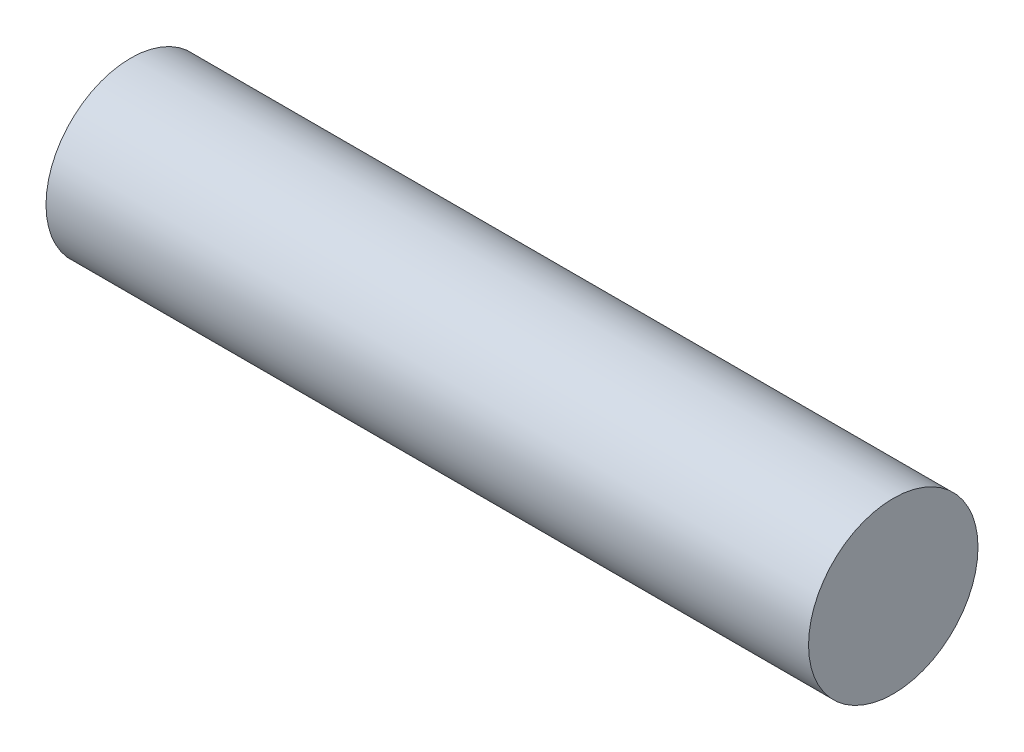
ISO-10303-21;
HEADER;
FILE_DESCRIPTION(('STEP AP214'),'2;1');
FILE_NAME('part.step','',(''),(''),'','','');
FILE_SCHEMA(('AUTOMOTIVE_DESIGN { 1 0 10303 214 1 1 1 1 }'));
ENDSEC;
DATA;
#1=APPLICATION_CONTEXT('core data for automotive mechanical design processes');
#2=APPLICATION_PROTOCOL_DEFINITION('international standard','automotive_design',2000,#1);
#3=PRODUCT_CONTEXT('',#1,'mechanical');
#4=PRODUCT('Part','Part','',(#3));
#5=PRODUCT_RELATED_PRODUCT_CATEGORY('part','',(#4));
#6=PRODUCT_DEFINITION_FORMATION('','',#4);
#7=PRODUCT_DEFINITION_CONTEXT('part definition',#1,'design');
#8=PRODUCT_DEFINITION('design','',#6,#7);
#9=PRODUCT_DEFINITION_SHAPE('','',#8);
#10=(LENGTH_UNIT() NAMED_UNIT(*) SI_UNIT(.MILLI.,.METRE.));
#11=(NAMED_UNIT(*) PLANE_ANGLE_UNIT() SI_UNIT($,.RADIAN.));
#12=(NAMED_UNIT(*) SI_UNIT($,.STERADIAN.) SOLID_ANGLE_UNIT());
#13=UNCERTAINTY_MEASURE_WITH_UNIT(LENGTH_MEASURE(1.E-05),#10,'distance_accuracy_value','');
#14=(GEOMETRIC_REPRESENTATION_CONTEXT(3) GLOBAL_UNCERTAINTY_ASSIGNED_CONTEXT((#13)) GLOBAL_UNIT_ASSIGNED_CONTEXT((#10,
#11,#12)) REPRESENTATION_CONTEXT('',''));
#15=CARTESIAN_POINT('',(0.,0.,0.));
#16=DIRECTION('',(0.,0.,1.));
#17=DIRECTION('',(1.,0.,0.));
#18=AXIS2_PLACEMENT_3D('',#15,#16,#17);
#19=CARTESIAN_POINT('',(22.5,0.,0.));
#20=DIRECTION('',(-1.,0.,0.));
#21=DIRECTION('',(0.,0.,1.));
#22=AXIS2_PLACEMENT_3D('',#19,#20,#21);
#23=CYLINDRICAL_SURFACE('',#22,2.5);
#24=CARTESIAN_POINT('',(22.5,0.,0.));
#25=DIRECTION('',(1.,0.,0.));
#26=DIRECTION('',(0.,0.,-1.));
#27=AXIS2_PLACEMENT_3D('',#24,#25,#26);
#28=CIRCLE('',#27,2.5);
#29=CARTESIAN_POINT('',(22.5,0.,2.5));
#30=VERTEX_POINT('',#29);
#31=EDGE_CURVE('E10',#30,#30,#28,.T.);
#32=CARTESIAN_POINT('',(0.,0.,0.));
#33=DIRECTION('',(1.,0.,0.));
#34=DIRECTION('',(0.,0.,-1.));
#35=AXIS2_PLACEMENT_3D('',#32,#33,#34);
#36=CIRCLE('',#35,2.5);
#37=CARTESIAN_POINT('',(0.,0.,2.5));
#38=VERTEX_POINT('',#37);
#39=EDGE_CURVE('E46',#38,#38,#36,.T.);
#40=CARTESIAN_POINT('',(22.5,0.,2.5));
#41=CARTESIAN_POINT('',(22.265625,0.,2.5));
#42=CARTESIAN_POINT('',(22.03125,0.,2.5));
#43=CARTESIAN_POINT('',(21.5625,0.,2.5));
#44=CARTESIAN_POINT('',(21.328125,0.,2.5));
#45=CARTESIAN_POINT('',(20.859375,0.,2.5));
#46=CARTESIAN_POINT('',(20.625,0.,2.5));
#47=CARTESIAN_POINT('',(20.15625,0.,2.5));
#48=CARTESIAN_POINT('',(19.921875,0.,2.5));
#49=CARTESIAN_POINT('',(19.453125,0.,2.5));
#50=CARTESIAN_POINT('',(19.21875,0.,2.5));
#51=CARTESIAN_POINT('',(18.75,0.,2.5));
#52=CARTESIAN_POINT('',(18.515625,0.,2.5));
#53=CARTESIAN_POINT('',(18.046875,0.,2.5));
#54=CARTESIAN_POINT('',(17.8125,0.,2.5));
#55=CARTESIAN_POINT('',(17.34375,0.,2.5));
#56=CARTESIAN_POINT('',(17.109375,0.,2.5));
#57=CARTESIAN_POINT('',(16.640625,0.,2.5));
#58=CARTESIAN_POINT('',(16.40625,0.,2.5));
#59=CARTESIAN_POINT('',(15.9375,0.,2.5));
#60=CARTESIAN_POINT('',(15.703125,0.,2.5));
#61=CARTESIAN_POINT('',(15.234375,0.,2.5));
#62=CARTESIAN_POINT('',(15.,0.,2.5));
#63=CARTESIAN_POINT('',(14.53125,0.,2.5));
#64=CARTESIAN_POINT('',(14.296875,0.,2.5));
#65=CARTESIAN_POINT('',(13.828125,0.,2.5));
#66=CARTESIAN_POINT('',(13.59375,0.,2.5));
#67=CARTESIAN_POINT('',(13.125,0.,2.5));
#68=CARTESIAN_POINT('',(12.890625,0.,2.5));
#69=CARTESIAN_POINT('',(12.421875,0.,2.5));
#70=CARTESIAN_POINT('',(12.1875,0.,2.5));
#71=CARTESIAN_POINT('',(11.71875,0.,2.5));
#72=CARTESIAN_POINT('',(11.484375,0.,2.5));
#73=CARTESIAN_POINT('',(11.015625,0.,2.5));
#74=CARTESIAN_POINT('',(10.78125,0.,2.5));
#75=CARTESIAN_POINT('',(10.3125,0.,2.5));
#76=CARTESIAN_POINT('',(10.078125,0.,2.5));
#77=CARTESIAN_POINT('',(9.60937499999999,0.,2.5));
#78=CARTESIAN_POINT('',(9.375,0.,2.5));
#79=CARTESIAN_POINT('',(8.90625,0.,2.5));
#80=CARTESIAN_POINT('',(8.671875,0.,2.5));
#81=CARTESIAN_POINT('',(8.20312499999999,0.,2.5));
#82=CARTESIAN_POINT('',(7.96874999999999,0.,2.5));
#83=CARTESIAN_POINT('',(7.5,0.,2.5));
#84=CARTESIAN_POINT('',(7.265625,0.,2.5));
#85=CARTESIAN_POINT('',(6.796875,0.,2.5));
#86=CARTESIAN_POINT('',(6.5625,0.,2.5));
#87=CARTESIAN_POINT('',(6.09375,0.,2.5));
#88=CARTESIAN_POINT('',(5.859375,0.,2.5));
#89=CARTESIAN_POINT('',(5.390625,0.,2.5));
#90=CARTESIAN_POINT('',(5.15625,0.,2.5));
#91=CARTESIAN_POINT('',(4.6875,0.,2.5));
#92=CARTESIAN_POINT('',(4.453125,0.,2.5));
#93=CARTESIAN_POINT('',(3.984375,0.,2.5));
#94=CARTESIAN_POINT('',(3.75,0.,2.5));
#95=CARTESIAN_POINT('',(3.28125,0.,2.5));
#96=CARTESIAN_POINT('',(3.046875,0.,2.5));
#97=CARTESIAN_POINT('',(2.578125,0.,2.5));
#98=CARTESIAN_POINT('',(2.34375,0.,2.5));
#99=CARTESIAN_POINT('',(1.875,0.,2.5));
#100=CARTESIAN_POINT('',(1.640625,0.,2.5));
#101=CARTESIAN_POINT('',(1.171875,0.,2.5));
#102=CARTESIAN_POINT('',(0.937499999999996,0.,2.5));
#103=CARTESIAN_POINT('',(0.468749999999996,0.,2.5));
#104=CARTESIAN_POINT('',(0.234374999999996,0.,2.5));
#105=CARTESIAN_POINT('',(0.,0.,2.5));
#106=B_SPLINE_CURVE_WITH_KNOTS('',3,(#40,#41,#42,#43,#44,#45,#46,#47,#48,#49,#50,#51,#52,#53,
#54,#55,#56,#57,#58,#59,#60,#61,#62,#63,#64,#65,#66,#67,#68,#69,#70,#71,#72,#73,#74,#75,#76,#77,
#78,#79,#80,#81,#82,#83,#84,#85,#86,#87,#88,#89,#90,#91,#92,#93,#94,#95,#96,#97,#98,#99,#100,
#101,#102,#103,#104,#105),.UNSPECIFIED.,.F.,.F.,(4,2,2,2,2,2,2,2,2,2,2,2,2,2,2,2,2,2,2,2,2,2,2,
2,2,2,2,2,2,2,2,2,4),(0.,0.703125000000002,1.40625,2.109375,2.8125,3.515625,4.21875,4.921875,
5.625,6.328125,7.03125,7.734375,8.4375,9.140625,9.84375,10.546875,11.25,11.953125,12.65625,
13.359375,14.0625,14.765625,15.46875,16.171875,16.875,17.578125,18.28125,18.984375,19.6875,
20.390625,21.09375,21.796875,22.5),.UNSPECIFIED.);
#107=EDGE_CURVE('BSEAM43',#30,#38,#106,.T.);
#108=ORIENTED_EDGE('',*,*,#31,.F.);
#109=ORIENTED_EDGE('',*,*,#39,.T.);
#110=ORIENTED_EDGE('',*,*,#107,.T.);
#111=ORIENTED_EDGE('',*,*,#107,.F.);
#112=EDGE_LOOP('',(#108,#110,#109,#111));
#113=FACE_BOUND('',#112,.T.);
#114=ADVANCED_FACE('F43',(#113),#23,.T.);
#115=CARTESIAN_POINT('',(22.5,0.,0.));
#116=DIRECTION('',(1.,0.,0.));
#117=DIRECTION('',(0.,0.,-1.));
#118=AXIS2_PLACEMENT_3D('',#115,#116,#117);
#119=PLANE('',#118);
#120=ORIENTED_EDGE('',*,*,#31,.T.);
#121=EDGE_LOOP('',(#120));
#122=FACE_BOUND('',#121,.T.);
#123=ADVANCED_FACE('F60',(#122),#119,.T.);
#124=CARTESIAN_POINT('',(0.,0.,0.));
#125=DIRECTION('',(1.,0.,0.));
#126=DIRECTION('',(0.,0.,-1.));
#127=AXIS2_PLACEMENT_3D('',#124,#125,#126);
#128=PLANE('',#127);
#129=ORIENTED_EDGE('',*,*,#39,.F.);
#130=EDGE_LOOP('',(#129));
#131=FACE_BOUND('',#130,.T.);
#132=ADVANCED_FACE('F58',(#131),#128,.F.);
#133=CLOSED_SHELL('',(#114,#123,#132));
#134=MANIFOLD_SOLID_BREP('B2',#133);
#135=ADVANCED_BREP_SHAPE_REPRESENTATION('',(#18,#134),#14);
#136=SHAPE_DEFINITION_REPRESENTATION(#9,#135);
ENDSEC;
END-ISO-10303-21;
